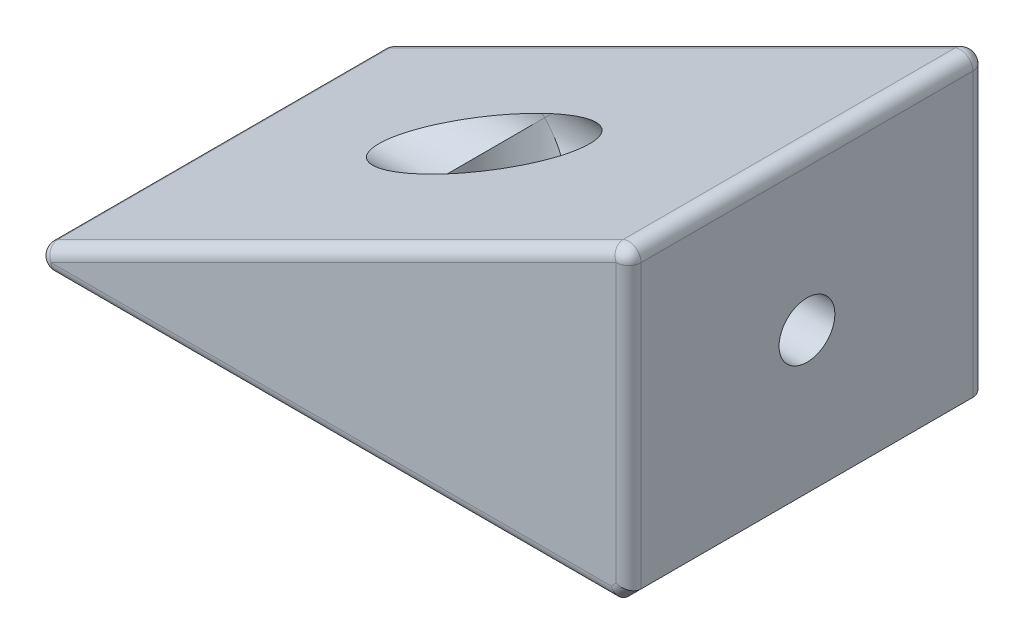
ISO-10303-21;
HEADER;
FILE_DESCRIPTION(('STEP AP214'),'2;1');
FILE_NAME('part.step','',(''),(''),'','','');
FILE_SCHEMA(('AUTOMOTIVE_DESIGN { 1 0 10303 214 1 1 1 1 }'));
ENDSEC;
DATA;
#1=APPLICATION_CONTEXT('core data for automotive mechanical design processes');
#2=APPLICATION_PROTOCOL_DEFINITION('international standard','automotive_design',2000,#1);
#3=PRODUCT_CONTEXT('',#1,'mechanical');
#4=PRODUCT('Part','Part','',(#3));
#5=PRODUCT_RELATED_PRODUCT_CATEGORY('part','',(#4));
#6=PRODUCT_DEFINITION_FORMATION('','',#4);
#7=PRODUCT_DEFINITION_CONTEXT('part definition',#1,'design');
#8=PRODUCT_DEFINITION('design','',#6,#7);
#9=PRODUCT_DEFINITION_SHAPE('','',#8);
#10=(LENGTH_UNIT() NAMED_UNIT(*) SI_UNIT(.MILLI.,.METRE.));
#11=(NAMED_UNIT(*) PLANE_ANGLE_UNIT() SI_UNIT($,.RADIAN.));
#12=(NAMED_UNIT(*) SI_UNIT($,.STERADIAN.) SOLID_ANGLE_UNIT());
#13=UNCERTAINTY_MEASURE_WITH_UNIT(LENGTH_MEASURE(1.E-05),#10,'distance_accuracy_value','');
#14=(GEOMETRIC_REPRESENTATION_CONTEXT(3) GLOBAL_UNCERTAINTY_ASSIGNED_CONTEXT((#13)) GLOBAL_UNIT_ASSIGNED_CONTEXT((#10,
#11,#12)) REPRESENTATION_CONTEXT('',''));
#15=CARTESIAN_POINT('',(0.,0.,0.));
#16=DIRECTION('',(0.,0.,1.));
#17=DIRECTION('',(1.,0.,0.));
#18=AXIS2_PLACEMENT_3D('',#15,#16,#17);
#19=CARTESIAN_POINT('',(-35.,12.3909830056251,0.));
#20=DIRECTION('',(1.,0.,0.));
#21=DIRECTION('',(0.,0.,-1.));
#22=AXIS2_PLACEMENT_3D('',#19,#20,#21);
#23=CYLINDRICAL_SURFACE('',#22,4.25);
#24=CARTESIAN_POINT('',(-5.,12.3909830056251,0.));
#25=DIRECTION('',(1.,0.,0.));
#26=DIRECTION('',(0.,0.,-1.));
#27=AXIS2_PLACEMENT_3D('',#24,#25,#26);
#28=CIRCLE('',#27,4.25);
#29=CARTESIAN_POINT('',(-5.,12.3909830056251,-4.25));
#30=VERTEX_POINT('',#29);
#31=EDGE_CURVE('E325',#30,#30,#28,.T.);
#32=ORIENTED_EDGE('',*,*,#31,.T.);
#33=EDGE_LOOP('',(#32));
#34=FACE_BOUND('',#33,.T.);
#35=CARTESIAN_POINT('',(-25.4,12.3909830056251,0.));
#36=DIRECTION('',(0.707106781186547,0.707106781186547,0.));
#37=DIRECTION('',(0.707106781186547,-0.707106781186547,0.));
#38=AXIS2_PLACEMENT_3D('',#35,#36,#37);
#39=ELLIPSE('',#38,6.01040764008565,4.25);
#40=CARTESIAN_POINT('',(-25.4,12.3909830056251,-4.25));
#41=VERTEX_POINT('',#40);
#42=CARTESIAN_POINT('',(-25.4,12.3909830056251,4.25));
#43=VERTEX_POINT('',#42);
#44=EDGE_CURVE('E160',#41,#43,#39,.F.);
#45=ORIENTED_EDGE('',*,*,#44,.T.);
#46=CARTESIAN_POINT('',(-25.4,12.3909830056251,0.));
#47=DIRECTION('',(0.707106781186547,-0.707106781186547,0.));
#48=DIRECTION('',(0.707106781186547,0.707106781186547,0.));
#49=AXIS2_PLACEMENT_3D('',#46,#47,#48);
#50=ELLIPSE('',#49,6.01040764008565,4.25);
#51=CARTESIAN_POINT('',(-24.7819660112498,13.0090169943751,4.20482270598293));
#52=VERTEX_POINT('',#51);
#53=EDGE_CURVE('E172',#43,#52,#50,.F.);
#54=ORIENTED_EDGE('',*,*,#53,.T.);
#55=CARTESIAN_POINT('',(-26.0180339887499,12.3909830056251,0.));
#56=DIRECTION('',(0.447213595499958,-0.894427190999916,0.));
#57=DIRECTION('',(0.894427190999916,0.447213595499958,0.));
#58=AXIS2_PLACEMENT_3D('',#55,#56,#57);
#59=ELLIPSE('',#58,9.50328890437411,4.25);
#60=CARTESIAN_POINT('',(-24.7819660112498,13.0090169943751,-4.20482270598293));
#61=VERTEX_POINT('',#60);
#62=EDGE_CURVE('E170',#61,#52,#59,.T.);
#63=ORIENTED_EDGE('',*,*,#62,.F.);
#64=EDGE_CURVE('E146',#61,#41,#50,.F.);
#65=ORIENTED_EDGE('',*,*,#64,.T.);
#66=EDGE_LOOP('',(#45,#54,#63,#65));
#67=FACE_BOUND('',#66,.T.);
#68=ADVANCED_FACE('F47',(#34,#67),#23,.F.);
#69=CARTESIAN_POINT('',(-50.8,0.,14.375));
#70=DIRECTION('',(0.,1.,0.));
#71=DIRECTION('',(0.,0.,1.));
#72=AXIS2_PLACEMENT_3D('',#69,#70,#71);
#73=PLANE('',#72);
#74=DIRECTION('',(0.,0.,-1.));
#75=VECTOR('',#74,1.);
#76=CARTESIAN_POINT('',(-46.5639320225002,0.,14.375));
#77=LINE('',#76,#75);
#78=CARTESIAN_POINT('',(-46.5639320225002,0.,13.375));
#79=VERTEX_POINT('',#78);
#80=CARTESIAN_POINT('',(-46.5639320225002,0.,-13.375));
#81=VERTEX_POINT('',#80);
#82=EDGE_CURVE('E212',#79,#81,#77,.T.);
#83=ORIENTED_EDGE('',*,*,#82,.T.);
#84=DIRECTION('',(1.,0.,0.));
#85=VECTOR('',#84,1.);
#86=CARTESIAN_POINT('',(-50.8,0.,-13.375));
#87=LINE('',#86,#85);
#88=CARTESIAN_POINT('',(-1.00000000000001,0.,-13.375));
#89=VERTEX_POINT('',#88);
#90=EDGE_CURVE('E218',#81,#89,#87,.T.);
#91=ORIENTED_EDGE('',*,*,#90,.T.);
#92=DIRECTION('',(0.,0.,1.));
#93=VECTOR('',#92,1.);
#94=CARTESIAN_POINT('',(-1.00000000000001,0.,14.375));
#95=LINE('',#94,#93);
#96=CARTESIAN_POINT('',(-1.00000000000001,0.,13.375));
#97=VERTEX_POINT('',#96);
#98=EDGE_CURVE('E182',#89,#97,#95,.T.);
#99=ORIENTED_EDGE('',*,*,#98,.T.);
#100=DIRECTION('',(1.,0.,0.));
#101=VECTOR('',#100,1.);
#102=CARTESIAN_POINT('',(-50.8,0.,13.375));
#103=LINE('',#102,#101);
#104=EDGE_CURVE('E215',#97,#79,#103,.F.);
#105=ORIENTED_EDGE('',*,*,#104,.T.);
#106=EDGE_LOOP('',(#83,#91,#99,#105));
#107=FACE_BOUND('',#106,.T.);
#108=CARTESIAN_POINT('',(-25.4,0.,0.));
#109=DIRECTION('',(0.,-1.,0.));
#110=DIRECTION('',(0.,0.,-1.));
#111=AXIS2_PLACEMENT_3D('',#108,#109,#110);
#112=CIRCLE('',#111,2.24999999999999);
#113=CARTESIAN_POINT('',(-25.4,0.,-2.24999999999999));
#114=VERTEX_POINT('',#113);
#115=EDGE_CURVE('E321',#114,#114,#112,.T.);
#116=ORIENTED_EDGE('',*,*,#115,.F.);
#117=EDGE_LOOP('',(#116));
#118=FACE_BOUND('',#117,.T.);
#119=ADVANCED_FACE('F356',(#107,#118),#73,.F.);
#120=CARTESIAN_POINT('',(0.,0.,14.375));
#121=DIRECTION('',(-1.,0.,0.));
#122=DIRECTION('',(0.,0.,1.));
#123=AXIS2_PLACEMENT_3D('',#120,#121,#122);
#124=PLANE('',#123);
#125=DIRECTION('',(0.,0.,-1.));
#126=VECTOR('',#125,1.);
#127=CARTESIAN_POINT('',(0.,1.,14.375));
#128=LINE('',#127,#126);
#129=CARTESIAN_POINT('',(0.,1.,13.375));
#130=VERTEX_POINT('',#129);
#131=CARTESIAN_POINT('',(0.,1.,-13.375));
#132=VERTEX_POINT('',#131);
#133=EDGE_CURVE('E178',#130,#132,#128,.T.);
#134=ORIENTED_EDGE('',*,*,#133,.T.);
#135=DIRECTION('',(0.,1.,0.));
#136=VECTOR('',#135,1.);
#137=CARTESIAN_POINT('',(0.,0.,-13.375));
#138=LINE('',#137,#136);
#139=CARTESIAN_POINT('',(0.,23.7819660112501,-13.375));
#140=VERTEX_POINT('',#139);
#141=EDGE_CURVE('E234',#132,#140,#138,.T.);
#142=ORIENTED_EDGE('',*,*,#141,.T.);
#143=DIRECTION('',(0.,0.,-1.));
#144=VECTOR('',#143,1.);
#145=CARTESIAN_POINT('',(0.,23.7819660112501,14.375));
#146=LINE('',#145,#144);
#147=CARTESIAN_POINT('',(0.,23.7819660112501,13.375));
#148=VERTEX_POINT('',#147);
#149=EDGE_CURVE('E228',#140,#148,#146,.F.);
#150=ORIENTED_EDGE('',*,*,#149,.T.);
#151=DIRECTION('',(0.,1.,0.));
#152=VECTOR('',#151,1.);
#153=CARTESIAN_POINT('',(0.,1.,13.375));
#154=LINE('',#153,#152);
#155=EDGE_CURVE('E231',#148,#130,#154,.F.);
#156=ORIENTED_EDGE('',*,*,#155,.T.);
#157=EDGE_LOOP('',(#134,#142,#150,#156));
#158=FACE_BOUND('',#157,.T.);
#159=CARTESIAN_POINT('',(0.,12.3909830056251,0.));
#160=DIRECTION('',(1.,0.,0.));
#161=DIRECTION('',(0.,0.,-1.));
#162=AXIS2_PLACEMENT_3D('',#159,#160,#161);
#163=CIRCLE('',#162,2.24999999999999);
#164=CARTESIAN_POINT('',(0.,12.3909830056251,-2.24999999999999));
#165=VERTEX_POINT('',#164);
#166=EDGE_CURVE('E166',#165,#165,#163,.T.);
#167=ORIENTED_EDGE('',*,*,#166,.F.);
#168=EDGE_LOOP('',(#167));
#169=FACE_BOUND('',#168,.T.);
#170=ADVANCED_FACE('F364',(#158,#169),#124,.F.);
#171=CARTESIAN_POINT('',(0.,25.4,14.375));
#172=DIRECTION('',(0.447213595499958,-0.894427190999916,0.));
#173=DIRECTION('',(0.894427190999916,0.447213595499958,0.));
#174=AXIS2_PLACEMENT_3D('',#171,#172,#173);
#175=PLANE('',#174);
#176=DIRECTION('',(-0.894427190999916,-0.447213595499958,0.));
#177=VECTOR('',#176,1.);
#178=CARTESIAN_POINT('',(0.,25.4,-13.375));
#179=LINE('',#178,#177);
#180=CARTESIAN_POINT('',(-1.44721359549996,24.67639320225,-13.375));
#181=VERTEX_POINT('',#180);
#182=CARTESIAN_POINT('',(-47.0111456180002,1.89442719099992,-13.375));
#183=VERTEX_POINT('',#182);
#184=EDGE_CURVE('E192',#181,#183,#179,.T.);
#185=ORIENTED_EDGE('',*,*,#184,.T.);
#186=DIRECTION('',(0.,0.,-1.));
#187=VECTOR('',#186,1.);
#188=CARTESIAN_POINT('',(-47.0111456180002,1.89442719099992,14.375));
#189=LINE('',#188,#187);
#190=CARTESIAN_POINT('',(-47.0111456180002,1.89442719099992,13.375));
#191=VERTEX_POINT('',#190);
#192=EDGE_CURVE('E196',#183,#191,#189,.F.);
#193=ORIENTED_EDGE('',*,*,#192,.T.);
#194=DIRECTION('',(-0.894427190999916,-0.447213595499958,0.));
#195=VECTOR('',#194,1.);
#196=CARTESIAN_POINT('',(0.,25.4,13.375));
#197=LINE('',#196,#195);
#198=CARTESIAN_POINT('',(-1.44721359549996,24.67639320225,13.375));
#199=VERTEX_POINT('',#198);
#200=EDGE_CURVE('E189',#191,#199,#197,.F.);
#201=ORIENTED_EDGE('',*,*,#200,.T.);
#202=DIRECTION('',(0.,0.,-1.));
#203=VECTOR('',#202,1.);
#204=CARTESIAN_POINT('',(-1.44721359549996,24.67639320225,14.375));
#205=LINE('',#204,#203);
#206=EDGE_CURVE('E186',#199,#181,#205,.T.);
#207=ORIENTED_EDGE('',*,*,#206,.T.);
#208=EDGE_LOOP('',(#185,#193,#201,#207));
#209=FACE_BOUND('',#208,.T.);
#210=CARTESIAN_POINT('',(-25.6060113295833,12.5969943352084,4.24500404382414));
#211=VERTEX_POINT('',#210);
#212=CARTESIAN_POINT('',(-25.6060113295833,12.5969943352084,-4.24500404382414));
#213=VERTEX_POINT('',#212);
#214=EDGE_CURVE('E333',#211,#213,#59,.T.);
#215=ORIENTED_EDGE('',*,*,#214,.T.);
#216=CARTESIAN_POINT('',(-25.4,12.7,0.));
#217=DIRECTION('',(0.447213595499958,-0.894427190999916,0.));
#218=DIRECTION('',(-0.894427190999916,-0.447213595499958,0.));
#219=AXIS2_PLACEMENT_3D('',#216,#217,#218);
#220=ELLIPSE('',#219,4.75164445218705,4.25);
#221=EDGE_CURVE('E148',#213,#61,#220,.T.);
#222=ORIENTED_EDGE('',*,*,#221,.T.);
#223=ORIENTED_EDGE('',*,*,#62,.T.);
#224=EDGE_CURVE('E315',#52,#211,#220,.T.);
#225=ORIENTED_EDGE('',*,*,#224,.T.);
#226=EDGE_LOOP('',(#215,#222,#223,#225));
#227=FACE_BOUND('',#226,.T.);
#228=ADVANCED_FACE('F340',(#209,#227),#175,.F.);
#229=CARTESIAN_POINT('',(0.,0.,14.375));
#230=DIRECTION('',(0.,0.,1.));
#231=DIRECTION('',(1.,0.,0.));
#232=AXIS2_PLACEMENT_3D('',#229,#230,#231);
#233=PLANE('',#232);
#234=DIRECTION('',(0.,1.,0.));
#235=VECTOR('',#234,1.);
#236=CARTESIAN_POINT('',(-1.,25.4,14.375));
#237=LINE('',#236,#235);
#238=CARTESIAN_POINT('',(-1.,1.4142135623731,14.375));
#239=VERTEX_POINT('',#238);
#240=CARTESIAN_POINT('',(-1.,23.7819660112501,14.375));
#241=VERTEX_POINT('',#240);
#242=EDGE_CURVE('E57',#239,#241,#237,.T.);
#243=ORIENTED_EDGE('',*,*,#242,.T.);
#244=DIRECTION('',(-0.894427190999916,-0.447213595499958,0.));
#245=VECTOR('',#244,1.);
#246=CARTESIAN_POINT('',(-50.3527864045001,-0.89442719099992,14.375));
#247=LINE('',#246,#245);
#248=CARTESIAN_POINT('',(-46.5639320225002,1.,14.375));
#249=VERTEX_POINT('',#248);
#250=EDGE_CURVE('E11',#241,#249,#247,.T.);
#251=ORIENTED_EDGE('',*,*,#250,.T.);
#252=DIRECTION('',(1.,0.,0.));
#253=VECTOR('',#252,1.);
#254=CARTESIAN_POINT('',(-1.00000000000001,1.,14.375));
#255=LINE('',#254,#253);
#256=CARTESIAN_POINT('',(-1.4142135623731,1.,14.375));
#257=VERTEX_POINT('',#256);
#258=EDGE_CURVE('E237',#249,#257,#255,.T.);
#259=ORIENTED_EDGE('',*,*,#258,.T.);
#260=DIRECTION('',(-0.70710678118655,-0.707106781186545,0.));
#261=VECTOR('',#260,1.);
#262=CARTESIAN_POINT('',(-1.20710678118655,1.20710678118655,14.375));
#263=LINE('',#262,#261);
#264=EDGE_CURVE('E68',#257,#239,#263,.F.);
#265=ORIENTED_EDGE('',*,*,#264,.T.);
#266=EDGE_LOOP('',(#243,#251,#259,#265));
#267=FACE_BOUND('',#266,.T.);
#268=ADVANCED_FACE('F382',(#267),#233,.T.);
#269=CARTESIAN_POINT('',(0.,0.,-14.375));
#270=DIRECTION('',(0.,0.,1.));
#271=DIRECTION('',(1.,0.,0.));
#272=AXIS2_PLACEMENT_3D('',#269,#270,#271);
#273=PLANE('',#272);
#274=DIRECTION('',(1.,0.,0.));
#275=VECTOR('',#274,1.);
#276=CARTESIAN_POINT('',(0.,1.,-14.375));
#277=LINE('',#276,#275);
#278=CARTESIAN_POINT('',(-1.4142135623731,1.,-14.375));
#279=VERTEX_POINT('',#278);
#280=CARTESIAN_POINT('',(-46.5639320225002,1.,-14.375));
#281=VERTEX_POINT('',#280);
#282=EDGE_CURVE('E205',#279,#281,#277,.F.);
#283=ORIENTED_EDGE('',*,*,#282,.T.);
#284=DIRECTION('',(-0.894427190999916,-0.447213595499958,0.));
#285=VECTOR('',#284,1.);
#286=CARTESIAN_POINT('',(-9.71278640450004,19.4255728090001,-14.375));
#287=LINE('',#286,#285);
#288=CARTESIAN_POINT('',(-1.,23.7819660112501,-14.375));
#289=VERTEX_POINT('',#288);
#290=EDGE_CURVE('E208',#281,#289,#287,.F.);
#291=ORIENTED_EDGE('',*,*,#290,.T.);
#292=DIRECTION('',(0.,1.,0.));
#293=VECTOR('',#292,1.);
#294=CARTESIAN_POINT('',(-1.,0.,-14.375));
#295=LINE('',#294,#293);
#296=CARTESIAN_POINT('',(-1.,1.4142135623731,-14.375));
#297=VERTEX_POINT('',#296);
#298=EDGE_CURVE('E199',#289,#297,#295,.F.);
#299=ORIENTED_EDGE('',*,*,#298,.T.);
#300=DIRECTION('',(0.70710678118655,0.707106781186545,0.));
#301=VECTOR('',#300,1.);
#302=CARTESIAN_POINT('',(-1.70710678118655,0.70710678118655,-14.375));
#303=LINE('',#302,#301);
#304=EDGE_CURVE('E202',#297,#279,#303,.F.);
#305=ORIENTED_EDGE('',*,*,#304,.T.);
#306=EDGE_LOOP('',(#283,#291,#299,#305));
#307=FACE_BOUND('',#306,.T.);
#308=ADVANCED_FACE('F377',(#307),#273,.F.);
#309=CARTESIAN_POINT('',(0.,12.3909830056251,0.));
#310=DIRECTION('',(1.,0.,0.));
#311=DIRECTION('',(0.,0.,-1.));
#312=AXIS2_PLACEMENT_3D('',#309,#310,#311);
#313=CYLINDRICAL_SURFACE('',#312,2.24999999999999);
#314=CARTESIAN_POINT('',(-5.,12.3909830056251,0.));
#315=DIRECTION('',(1.,0.,0.));
#316=DIRECTION('',(0.,0.,-1.));
#317=AXIS2_PLACEMENT_3D('',#314,#315,#316);
#318=CIRCLE('',#317,2.24999999999999);
#319=CARTESIAN_POINT('',(-5.,12.3909830056251,-2.24999999999999));
#320=VERTEX_POINT('',#319);
#321=EDGE_CURVE('E329',#320,#320,#318,.F.);
#322=ORIENTED_EDGE('',*,*,#321,.T.);
#323=EDGE_LOOP('',(#322));
#324=FACE_BOUND('',#323,.T.);
#325=ORIENTED_EDGE('',*,*,#166,.T.);
#326=EDGE_LOOP('',(#325));
#327=FACE_BOUND('',#326,.T.);
#328=ADVANCED_FACE('F370',(#324,#327),#313,.F.);
#329=CARTESIAN_POINT('',(-25.4,12.3909830056251,0.));
#330=DIRECTION('',(0.707106781186547,0.707106781186547,0.));
#331=DIRECTION('',(0.707106781186547,-0.707106781186547,0.));
#332=AXIS2_PLACEMENT_3D('',#329,#330,#331);
#333=ELLIPSE('',#332,6.01040764008565,4.25);
#334=EDGE_CURVE('E155',#211,#43,#333,.T.);
#335=ORIENTED_EDGE('',*,*,#334,.T.);
#336=CARTESIAN_POINT('',(-25.4,12.3909830056251,0.));
#337=DIRECTION('',(0.707106781186547,-0.707106781186547,0.));
#338=DIRECTION('',(0.707106781186547,0.707106781186547,0.));
#339=AXIS2_PLACEMENT_3D('',#336,#337,#338);
#340=ELLIPSE('',#339,6.01040764008565,4.25);
#341=EDGE_CURVE('E154',#43,#41,#340,.T.);
#342=ORIENTED_EDGE('',*,*,#341,.T.);
#343=EDGE_CURVE('E142',#41,#213,#333,.T.);
#344=ORIENTED_EDGE('',*,*,#343,.T.);
#345=ORIENTED_EDGE('',*,*,#214,.F.);
#346=EDGE_LOOP('',(#335,#342,#344,#345));
#347=FACE_BOUND('',#346,.T.);
#348=ADVANCED_FACE('F174',(#347),#23,.F.);
#349=CARTESIAN_POINT('',(-5.,12.3909830056251,0.));
#350=DIRECTION('',(1.,0.,0.));
#351=DIRECTION('',(0.,0.,-1.));
#352=AXIS2_PLACEMENT_3D('',#349,#350,#351);
#353=PLANE('',#352);
#354=ORIENTED_EDGE('',*,*,#31,.F.);
#355=EDGE_LOOP('',(#354));
#356=FACE_BOUND('',#355,.T.);
#357=ORIENTED_EDGE('',*,*,#321,.F.);
#358=EDGE_LOOP('',(#357));
#359=FACE_BOUND('',#358,.T.);
#360=ADVANCED_FACE('F369',(#356,#359),#353,.F.);
#361=CARTESIAN_POINT('',(-25.4,0.,0.));
#362=DIRECTION('',(0.,-1.,0.));
#363=DIRECTION('',(0.,0.,-1.));
#364=AXIS2_PLACEMENT_3D('',#361,#362,#363);
#365=CYLINDRICAL_SURFACE('',#364,2.24999999999999);
#366=CARTESIAN_POINT('',(-25.4,5.,0.));
#367=DIRECTION('',(0.,-1.,0.));
#368=DIRECTION('',(0.,0.,-1.));
#369=AXIS2_PLACEMENT_3D('',#366,#367,#368);
#370=CIRCLE('',#369,2.24999999999999);
#371=CARTESIAN_POINT('',(-25.4,5.,-2.24999999999999));
#372=VERTEX_POINT('',#371);
#373=EDGE_CURVE('E309',#372,#372,#370,.F.);
#374=ORIENTED_EDGE('',*,*,#373,.T.);
#375=EDGE_LOOP('',(#374));
#376=FACE_BOUND('',#375,.T.);
#377=ORIENTED_EDGE('',*,*,#115,.T.);
#378=EDGE_LOOP('',(#377));
#379=FACE_BOUND('',#378,.T.);
#380=ADVANCED_FACE('F374',(#376,#379),#365,.F.);
#381=CARTESIAN_POINT('',(-25.4,5.,0.));
#382=DIRECTION('',(0.,-1.,0.));
#383=DIRECTION('',(0.,0.,-1.));
#384=AXIS2_PLACEMENT_3D('',#381,#382,#383);
#385=PLANE('',#384);
#386=CARTESIAN_POINT('',(-25.4,5.,0.));
#387=DIRECTION('',(0.,-1.,0.));
#388=DIRECTION('',(0.,0.,-1.));
#389=AXIS2_PLACEMENT_3D('',#386,#387,#388);
#390=CIRCLE('',#389,4.25);
#391=CARTESIAN_POINT('',(-25.4,5.,-4.25));
#392=VERTEX_POINT('',#391);
#393=EDGE_CURVE('E304',#392,#392,#390,.T.);
#394=ORIENTED_EDGE('',*,*,#393,.F.);
#395=EDGE_LOOP('',(#394));
#396=FACE_BOUND('',#395,.T.);
#397=ORIENTED_EDGE('',*,*,#373,.F.);
#398=EDGE_LOOP('',(#397));
#399=FACE_BOUND('',#398,.T.);
#400=ADVANCED_FACE('F352',(#396,#399),#385,.F.);
#401=CARTESIAN_POINT('',(-25.4,35.,0.));
#402=DIRECTION('',(0.,-1.,0.));
#403=DIRECTION('',(0.,0.,-1.));
#404=AXIS2_PLACEMENT_3D('',#401,#402,#403);
#405=CYLINDRICAL_SURFACE('',#404,4.25);
#406=ORIENTED_EDGE('',*,*,#393,.T.);
#407=EDGE_LOOP('',(#406));
#408=FACE_BOUND('',#407,.T.);
#409=ORIENTED_EDGE('',*,*,#44,.F.);
#410=ORIENTED_EDGE('',*,*,#341,.F.);
#411=EDGE_LOOP('',(#409,#410));
#412=FACE_BOUND('',#411,.T.);
#413=ADVANCED_FACE('F161',(#408,#412),#405,.F.);
#414=ORIENTED_EDGE('',*,*,#334,.F.);
#415=ORIENTED_EDGE('',*,*,#224,.F.);
#416=ORIENTED_EDGE('',*,*,#53,.F.);
#417=EDGE_LOOP('',(#414,#415,#416));
#418=FACE_BOUND('',#417,.T.);
#419=ADVANCED_FACE('F342',(#418),#405,.F.);
#420=ORIENTED_EDGE('',*,*,#221,.F.);
#421=ORIENTED_EDGE('',*,*,#343,.F.);
#422=ORIENTED_EDGE('',*,*,#64,.F.);
#423=EDGE_LOOP('',(#420,#421,#422));
#424=FACE_BOUND('',#423,.T.);
#425=ADVANCED_FACE('F144',(#424),#405,.F.);
#426=CARTESIAN_POINT('',(0.,1.,14.375));
#427=DIRECTION('',(-0.707106781186545,0.70710678118655,0.));
#428=DIRECTION('',(0.,0.,-1.));
#429=AXIS2_PLACEMENT_3D('',#426,#427,#428);
#430=PLANE('',#429);
#431=ORIENTED_EDGE('',*,*,#98,.F.);
#432=DIRECTION('',(-0.70710678118655,-0.707106781186545,0.));
#433=VECTOR('',#432,1.);
#434=CARTESIAN_POINT('',(0.,1.,-13.375));
#435=LINE('',#434,#433);
#436=EDGE_CURVE('E225',#89,#132,#435,.F.);
#437=ORIENTED_EDGE('',*,*,#436,.T.);
#438=ORIENTED_EDGE('',*,*,#133,.F.);
#439=DIRECTION('',(0.70710678118655,0.707106781186545,0.));
#440=VECTOR('',#439,1.);
#441=CARTESIAN_POINT('',(0.,1.,13.375));
#442=LINE('',#441,#440);
#443=EDGE_CURVE('E222',#130,#97,#442,.F.);
#444=ORIENTED_EDGE('',*,*,#443,.T.);
#445=EDGE_LOOP('',(#431,#437,#438,#444));
#446=FACE_BOUND('',#445,.T.);
#447=ADVANCED_FACE('F351',(#446),#430,.F.);
#448=CARTESIAN_POINT('',(-1.20710678118655,1.20710678118655,13.375));
#449=DIRECTION('',(-0.70710678118655,-0.707106781186545,0.));
#450=DIRECTION('',(0.707106781186545,-0.70710678118655,0.));
#451=AXIS2_PLACEMENT_3D('',#448,#449,#450);
#452=CYLINDRICAL_SURFACE('',#451,1.);
#453=CARTESIAN_POINT('',(-1.4142135623731,1.,13.375));
#454=DIRECTION('',(-0.923879532511287,-0.382683432365088,0.));
#455=DIRECTION('',(-0.382683432365088,0.923879532511287,0.));
#456=AXIS2_PLACEMENT_3D('',#453,#454,#455);
#457=ELLIPSE('',#456,1.08239220029239,1.);
#458=EDGE_CURVE('E295',#97,#257,#457,.T.);
#459=ORIENTED_EDGE('',*,*,#458,.F.);
#460=ORIENTED_EDGE('',*,*,#443,.F.);
#461=CARTESIAN_POINT('',(-1.,1.4142135623731,13.375));
#462=DIRECTION('',(-0.382683432365091,-0.923879532511286,0.));
#463=DIRECTION('',(-0.923879532511286,0.382683432365091,0.));
#464=AXIS2_PLACEMENT_3D('',#461,#462,#463);
#465=ELLIPSE('',#464,1.08239220029239,1.);
#466=EDGE_CURVE('E51',#239,#130,#465,.F.);
#467=ORIENTED_EDGE('',*,*,#466,.F.);
#468=ORIENTED_EDGE('',*,*,#264,.F.);
#469=EDGE_LOOP('',(#459,#460,#467,#468));
#470=FACE_BOUND('',#469,.T.);
#471=ADVANCED_FACE('F49',(#470),#452,.T.);
#472=CARTESIAN_POINT('',(-1.,0.,13.375));
#473=DIRECTION('',(0.,-1.,0.));
#474=DIRECTION('',(0.,0.,-1.));
#475=AXIS2_PLACEMENT_3D('',#472,#473,#474);
#476=CYLINDRICAL_SURFACE('',#475,1.);
#477=ORIENTED_EDGE('',*,*,#466,.T.);
#478=ORIENTED_EDGE('',*,*,#155,.F.);
#479=CARTESIAN_POINT('',(-1.,23.7819660112501,13.375));
#480=DIRECTION('',(0.,1.,0.));
#481=DIRECTION('',(-1.,0.,0.));
#482=AXIS2_PLACEMENT_3D('',#479,#480,#481);
#483=CIRCLE('',#482,1.);
#484=EDGE_CURVE('E292',#241,#148,#483,.T.);
#485=ORIENTED_EDGE('',*,*,#484,.F.);
#486=ORIENTED_EDGE('',*,*,#242,.F.);
#487=EDGE_LOOP('',(#477,#478,#485,#486));
#488=FACE_BOUND('',#487,.T.);
#489=ADVANCED_FACE('F446',(#488),#476,.T.);
#490=CARTESIAN_POINT('',(-9.71278640450004,19.4255728090001,13.375));
#491=DIRECTION('',(0.894427190999916,0.447213595499958,0.));
#492=DIRECTION('',(-0.447213595499958,0.894427190999916,0.));
#493=AXIS2_PLACEMENT_3D('',#490,#491,#492);
#494=CYLINDRICAL_SURFACE('',#493,1.);
#495=CARTESIAN_POINT('',(-46.5639320225002,1.,13.375));
#496=DIRECTION('',(-0.894427190999919,-0.447213595499951,0.));
#497=DIRECTION('',(0.447213595499951,-0.894427190999919,0.));
#498=AXIS2_PLACEMENT_3D('',#495,#496,#497);
#499=CIRCLE('',#498,1.);
#500=EDGE_CURVE('E284',#249,#191,#499,.T.);
#501=ORIENTED_EDGE('',*,*,#500,.F.);
#502=ORIENTED_EDGE('',*,*,#250,.F.);
#503=CARTESIAN_POINT('',(-1.,23.7819660112501,13.375));
#504=DIRECTION('',(0.894427190999916,0.447213595499957,0.));
#505=DIRECTION('',(-0.447213595499958,0.894427190999916,0.));
#506=AXIS2_PLACEMENT_3D('',#503,#504,#505);
#507=CIRCLE('',#506,1.);
#508=EDGE_CURVE('E288',#199,#241,#507,.T.);
#509=ORIENTED_EDGE('',*,*,#508,.F.);
#510=ORIENTED_EDGE('',*,*,#200,.F.);
#511=EDGE_LOOP('',(#501,#502,#509,#510));
#512=FACE_BOUND('',#511,.T.);
#513=ADVANCED_FACE('F444',(#512),#494,.T.);
#514=CARTESIAN_POINT('',(0.,1.,13.375));
#515=DIRECTION('',(-1.,0.,0.));
#516=DIRECTION('',(0.,0.,1.));
#517=AXIS2_PLACEMENT_3D('',#514,#515,#516);
#518=CYLINDRICAL_SURFACE('',#517,1.);
#519=ORIENTED_EDGE('',*,*,#458,.T.);
#520=ORIENTED_EDGE('',*,*,#258,.F.);
#521=CARTESIAN_POINT('',(-46.5639320225002,1.,13.375));
#522=DIRECTION('',(-1.,0.,0.));
#523=DIRECTION('',(0.,0.,1.));
#524=AXIS2_PLACEMENT_3D('',#521,#522,#523);
#525=CIRCLE('',#524,1.);
#526=EDGE_CURVE('E281',#79,#249,#525,.T.);
#527=ORIENTED_EDGE('',*,*,#526,.F.);
#528=ORIENTED_EDGE('',*,*,#104,.F.);
#529=EDGE_LOOP('',(#519,#520,#527,#528));
#530=FACE_BOUND('',#529,.T.);
#531=ADVANCED_FACE('F440',(#530),#518,.T.);
#532=CARTESIAN_POINT('',(-1.,23.7819660112501,13.375));
#533=DIRECTION('',(0.,0.,1.));
#534=DIRECTION('',(0.,-1.,0.));
#535=AXIS2_PLACEMENT_3D('',#532,#533,#534);
#536=SPHERICAL_SURFACE('',#535,1.);
#537=ORIENTED_EDGE('',*,*,#508,.T.);
#538=ORIENTED_EDGE('',*,*,#484,.T.);
#539=CARTESIAN_POINT('',(-1.,23.7819660112501,13.375));
#540=DIRECTION('',(0.,0.,1.));
#541=DIRECTION('',(1.,0.,0.));
#542=AXIS2_PLACEMENT_3D('',#539,#540,#541);
#543=CIRCLE('',#542,1.);
#544=EDGE_CURVE('E273',#199,#148,#543,.F.);
#545=ORIENTED_EDGE('',*,*,#544,.F.);
#546=EDGE_LOOP('',(#537,#538,#545));
#547=FACE_BOUND('',#546,.T.);
#548=ADVANCED_FACE('F436',(#547),#536,.T.);
#549=CARTESIAN_POINT('',(-46.5639320225002,1.,13.375));
#550=DIRECTION('',(0.,0.,1.));
#551=DIRECTION('',(1.,0.,0.));
#552=AXIS2_PLACEMENT_3D('',#549,#550,#551);
#553=SPHERICAL_SURFACE('',#552,1.);
#554=ORIENTED_EDGE('',*,*,#526,.T.);
#555=ORIENTED_EDGE('',*,*,#500,.T.);
#556=CARTESIAN_POINT('',(-46.5639320225002,1.,13.375));
#557=DIRECTION('',(0.,0.,1.));
#558=DIRECTION('',(1.,0.,0.));
#559=AXIS2_PLACEMENT_3D('',#556,#557,#558);
#560=CIRCLE('',#559,1.);
#561=EDGE_CURVE('E269',#79,#191,#560,.F.);
#562=ORIENTED_EDGE('',*,*,#561,.F.);
#563=EDGE_LOOP('',(#554,#555,#562));
#564=FACE_BOUND('',#563,.T.);
#565=ADVANCED_FACE('F432',(#564),#553,.T.);
#566=CARTESIAN_POINT('',(-1.20710678118655,1.20710678118655,-13.375));
#567=DIRECTION('',(-0.70710678118655,-0.707106781186545,0.));
#568=DIRECTION('',(0.707106781186545,-0.70710678118655,0.));
#569=AXIS2_PLACEMENT_3D('',#566,#567,#568);
#570=CYLINDRICAL_SURFACE('',#569,1.);
#571=CARTESIAN_POINT('',(-1.4142135623731,1.,-13.375));
#572=DIRECTION('',(-0.923879532511287,-0.382683432365088,0.));
#573=DIRECTION('',(0.382683432365088,-0.923879532511287,0.));
#574=AXIS2_PLACEMENT_3D('',#571,#572,#573);
#575=ELLIPSE('',#574,1.08239220029239,1.);
#576=EDGE_CURVE('E266',#279,#89,#575,.T.);
#577=ORIENTED_EDGE('',*,*,#576,.F.);
#578=ORIENTED_EDGE('',*,*,#304,.F.);
#579=CARTESIAN_POINT('',(-1.,1.4142135623731,-13.375));
#580=DIRECTION('',(0.382683432365091,0.923879532511286,0.));
#581=DIRECTION('',(-0.923879532511286,0.382683432365091,0.));
#582=AXIS2_PLACEMENT_3D('',#579,#580,#581);
#583=ELLIPSE('',#582,1.08239220029239,1.);
#584=EDGE_CURVE('E277',#132,#297,#583,.T.);
#585=ORIENTED_EDGE('',*,*,#584,.F.);
#586=ORIENTED_EDGE('',*,*,#436,.F.);
#587=EDGE_LOOP('',(#577,#578,#585,#586));
#588=FACE_BOUND('',#587,.T.);
#589=ADVANCED_FACE('F428',(#588),#570,.T.);
#590=CARTESIAN_POINT('',(-1.,0.,-13.375));
#591=DIRECTION('',(0.,1.,0.));
#592=DIRECTION('',(0.,0.,1.));
#593=AXIS2_PLACEMENT_3D('',#590,#591,#592);
#594=CYLINDRICAL_SURFACE('',#593,1.);
#595=ORIENTED_EDGE('',*,*,#584,.T.);
#596=ORIENTED_EDGE('',*,*,#298,.F.);
#597=CARTESIAN_POINT('',(-1.,23.7819660112501,-13.375));
#598=DIRECTION('',(0.,1.,0.));
#599=DIRECTION('',(0.,0.,1.));
#600=AXIS2_PLACEMENT_3D('',#597,#598,#599);
#601=CIRCLE('',#600,1.);
#602=EDGE_CURVE('E262',#140,#289,#601,.T.);
#603=ORIENTED_EDGE('',*,*,#602,.F.);
#604=ORIENTED_EDGE('',*,*,#141,.F.);
#605=EDGE_LOOP('',(#595,#596,#603,#604));
#606=FACE_BOUND('',#605,.T.);
#607=ADVANCED_FACE('F424',(#606),#594,.T.);
#608=CARTESIAN_POINT('',(-1.,23.7819660112501,14.375));
#609=DIRECTION('',(0.,0.,-1.));
#610=DIRECTION('',(-1.,0.,0.));
#611=AXIS2_PLACEMENT_3D('',#608,#609,#610);
#612=CYLINDRICAL_SURFACE('',#611,1.);
#613=ORIENTED_EDGE('',*,*,#544,.T.);
#614=ORIENTED_EDGE('',*,*,#149,.F.);
#615=CARTESIAN_POINT('',(-1.,23.7819660112501,-13.375));
#616=DIRECTION('',(0.,0.,-1.));
#617=DIRECTION('',(-1.,0.,0.));
#618=AXIS2_PLACEMENT_3D('',#615,#616,#617);
#619=CIRCLE('',#618,1.);
#620=EDGE_CURVE('E258',#181,#140,#619,.T.);
#621=ORIENTED_EDGE('',*,*,#620,.F.);
#622=ORIENTED_EDGE('',*,*,#206,.F.);
#623=EDGE_LOOP('',(#613,#614,#621,#622));
#624=FACE_BOUND('',#623,.T.);
#625=ADVANCED_FACE('F420',(#624),#612,.T.);
#626=CARTESIAN_POINT('',(-46.5639320225002,1.,14.375));
#627=DIRECTION('',(0.,0.,-1.));
#628=DIRECTION('',(-1.,0.,0.));
#629=AXIS2_PLACEMENT_3D('',#626,#627,#628);
#630=CYLINDRICAL_SURFACE('',#629,1.);
#631=ORIENTED_EDGE('',*,*,#561,.T.);
#632=ORIENTED_EDGE('',*,*,#192,.F.);
#633=CARTESIAN_POINT('',(-46.5639320225002,1.,-13.375));
#634=DIRECTION('',(0.,0.,-1.));
#635=DIRECTION('',(-1.,0.,0.));
#636=AXIS2_PLACEMENT_3D('',#633,#634,#635);
#637=CIRCLE('',#636,1.);
#638=EDGE_CURVE('E254',#81,#183,#637,.T.);
#639=ORIENTED_EDGE('',*,*,#638,.F.);
#640=ORIENTED_EDGE('',*,*,#82,.F.);
#641=EDGE_LOOP('',(#631,#632,#639,#640));
#642=FACE_BOUND('',#641,.T.);
#643=ADVANCED_FACE('F416',(#642),#630,.T.);
#644=CARTESIAN_POINT('',(-50.8,1.,-13.375));
#645=DIRECTION('',(1.,0.,0.));
#646=DIRECTION('',(0.,0.,-1.));
#647=AXIS2_PLACEMENT_3D('',#644,#645,#646);
#648=CYLINDRICAL_SURFACE('',#647,1.);
#649=ORIENTED_EDGE('',*,*,#576,.T.);
#650=ORIENTED_EDGE('',*,*,#90,.F.);
#651=CARTESIAN_POINT('',(-46.5639320225002,1.,-13.375));
#652=DIRECTION('',(-1.,0.,0.));
#653=DIRECTION('',(0.,0.,1.));
#654=AXIS2_PLACEMENT_3D('',#651,#652,#653);
#655=CIRCLE('',#654,1.);
#656=EDGE_CURVE('E250',#281,#81,#655,.T.);
#657=ORIENTED_EDGE('',*,*,#656,.F.);
#658=ORIENTED_EDGE('',*,*,#282,.F.);
#659=EDGE_LOOP('',(#649,#650,#657,#658));
#660=FACE_BOUND('',#659,.T.);
#661=ADVANCED_FACE('F412',(#660),#648,.T.);
#662=CARTESIAN_POINT('',(-1.,23.7819660112501,-13.375));
#663=DIRECTION('',(0.,0.,-1.));
#664=DIRECTION('',(-1.,0.,0.));
#665=AXIS2_PLACEMENT_3D('',#662,#663,#664);
#666=SPHERICAL_SURFACE('',#665,1.);
#667=ORIENTED_EDGE('',*,*,#620,.T.);
#668=ORIENTED_EDGE('',*,*,#602,.T.);
#669=CARTESIAN_POINT('',(-1.,23.7819660112501,-13.375));
#670=DIRECTION('',(0.894427190999916,0.447213595499958,0.));
#671=DIRECTION('',(-0.447213595499958,0.894427190999916,0.));
#672=AXIS2_PLACEMENT_3D('',#669,#670,#671);
#673=CIRCLE('',#672,1.);
#674=EDGE_CURVE('E247',#181,#289,#673,.F.);
#675=ORIENTED_EDGE('',*,*,#674,.F.);
#676=EDGE_LOOP('',(#667,#668,#675));
#677=FACE_BOUND('',#676,.T.);
#678=ADVANCED_FACE('F408',(#677),#666,.T.);
#679=CARTESIAN_POINT('',(-46.5639320225002,1.,-13.375));
#680=DIRECTION('',(0.,0.,-1.));
#681=DIRECTION('',(-1.,0.,0.));
#682=AXIS2_PLACEMENT_3D('',#679,#680,#681);
#683=SPHERICAL_SURFACE('',#682,1.);
#684=ORIENTED_EDGE('',*,*,#656,.T.);
#685=ORIENTED_EDGE('',*,*,#638,.T.);
#686=CARTESIAN_POINT('',(-46.5639320225002,1.,-13.375));
#687=DIRECTION('',(-0.894427190999916,-0.447213595499957,0.));
#688=DIRECTION('',(0.447213595499957,-0.894427190999917,0.));
#689=AXIS2_PLACEMENT_3D('',#686,#687,#688);
#690=CIRCLE('',#689,1.);
#691=EDGE_CURVE('E244',#281,#183,#690,.F.);
#692=ORIENTED_EDGE('',*,*,#691,.F.);
#693=EDGE_LOOP('',(#684,#685,#692));
#694=FACE_BOUND('',#693,.T.);
#695=ADVANCED_FACE('F404',(#694),#683,.T.);
#696=CARTESIAN_POINT('',(0.447213595499958,24.5055728090001,-13.375));
#697=DIRECTION('',(-0.894427190999916,-0.447213595499958,0.));
#698=DIRECTION('',(0.447213595499958,-0.894427190999916,0.));
#699=AXIS2_PLACEMENT_3D('',#696,#697,#698);
#700=CYLINDRICAL_SURFACE('',#699,1.);
#701=ORIENTED_EDGE('',*,*,#674,.T.);
#702=ORIENTED_EDGE('',*,*,#290,.F.);
#703=ORIENTED_EDGE('',*,*,#691,.T.);
#704=ORIENTED_EDGE('',*,*,#184,.F.);
#705=EDGE_LOOP('',(#701,#702,#703,#704));
#706=FACE_BOUND('',#705,.T.);
#707=ADVANCED_FACE('F401',(#706),#700,.T.);
#708=CLOSED_SHELL('',(#68,#119,#170,#228,#268,#308,#328,#348,#360,#380,#400,#413,#419,#425,#447,
#471,#489,#513,#531,#548,#565,#589,#607,#625,#643,#661,#678,#695,#707));
#709=MANIFOLD_SOLID_BREP('B2',#708);
#710=ADVANCED_BREP_SHAPE_REPRESENTATION('',(#18,#709),#14);
#711=SHAPE_DEFINITION_REPRESENTATION(#9,#710);
ENDSEC;
END-ISO-10303-21;
